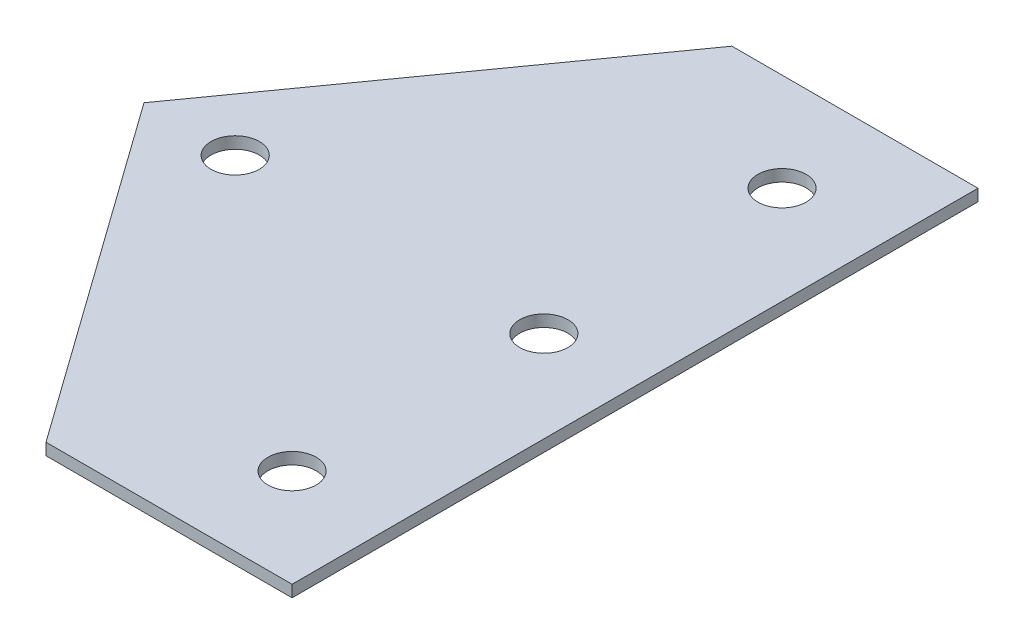
ISO-10303-21;
HEADER;
FILE_DESCRIPTION(('STEP AP214'),'2;1');
FILE_NAME('part.step','',(''),(''),'','','');
FILE_SCHEMA(('AUTOMOTIVE_DESIGN { 1 0 10303 214 1 1 1 1 }'));
ENDSEC;
DATA;
#1=APPLICATION_CONTEXT('core data for automotive mechanical design processes');
#2=APPLICATION_PROTOCOL_DEFINITION('international standard','automotive_design',2000,#1);
#3=PRODUCT_CONTEXT('',#1,'mechanical');
#4=PRODUCT('Part','Part','',(#3));
#5=PRODUCT_RELATED_PRODUCT_CATEGORY('part','',(#4));
#6=PRODUCT_DEFINITION_FORMATION('','',#4);
#7=PRODUCT_DEFINITION_CONTEXT('part definition',#1,'design');
#8=PRODUCT_DEFINITION('design','',#6,#7);
#9=PRODUCT_DEFINITION_SHAPE('','',#8);
#10=(LENGTH_UNIT() NAMED_UNIT(*) SI_UNIT(.MILLI.,.METRE.));
#11=(NAMED_UNIT(*) PLANE_ANGLE_UNIT() SI_UNIT($,.RADIAN.));
#12=(NAMED_UNIT(*) SI_UNIT($,.STERADIAN.) SOLID_ANGLE_UNIT());
#13=UNCERTAINTY_MEASURE_WITH_UNIT(LENGTH_MEASURE(1.E-05),#10,'distance_accuracy_value','');
#14=(GEOMETRIC_REPRESENTATION_CONTEXT(3) GLOBAL_UNCERTAINTY_ASSIGNED_CONTEXT((#13)) GLOBAL_UNIT_ASSIGNED_CONTEXT((#10,
#11,#12)) REPRESENTATION_CONTEXT('',''));
#15=CARTESIAN_POINT('',(0.,0.,0.));
#16=DIRECTION('',(0.,0.,1.));
#17=DIRECTION('',(1.,0.,0.));
#18=AXIS2_PLACEMENT_3D('',#15,#16,#17);
#19=CARTESIAN_POINT('',(-190.779220613583,6.096,0.));
#20=DIRECTION('',(0.813733471206715,0.,0.581238193719124));
#21=DIRECTION('',(0.581238193719124,0.,-0.813733471206715));
#22=AXIS2_PLACEMENT_3D('',#19,#20,#21);
#23=PLANE('',#22);
#24=DIRECTION('',(-0.581238193719124,0.,0.813733471206715));
#25=VECTOR('',#24,1.);
#26=CARTESIAN_POINT('',(-190.779220613583,0.,0.));
#27=LINE('',#26,#25);
#28=CARTESIAN_POINT('',(-63.779220613574,0.,-177.8));
#29=VERTEX_POINT('',#28);
#30=CARTESIAN_POINT('',(-190.779220613583,0.,0.));
#31=VERTEX_POINT('',#30);
#32=EDGE_CURVE('E126',#29,#31,#27,.T.);
#33=ORIENTED_EDGE('',*,*,#32,.T.);
#34=DIRECTION('',(0.,-1.,0.));
#35=VECTOR('',#34,1.);
#36=CARTESIAN_POINT('',(-190.779220613583,6.096,0.));
#37=LINE('',#36,#35);
#38=CARTESIAN_POINT('',(-190.779220613583,6.096,0.));
#39=VERTEX_POINT('',#38);
#40=EDGE_CURVE('E11',#39,#31,#37,.T.);
#41=ORIENTED_EDGE('',*,*,#40,.F.);
#42=DIRECTION('',(-0.581238193719124,0.,0.813733471206715));
#43=VECTOR('',#42,1.);
#44=CARTESIAN_POINT('',(-190.779220613583,6.096,0.));
#45=LINE('',#44,#43);
#46=CARTESIAN_POINT('',(-63.779220613574,6.096,-177.8));
#47=VERTEX_POINT('',#46);
#48=EDGE_CURVE('E139',#47,#39,#45,.T.);
#49=ORIENTED_EDGE('',*,*,#48,.F.);
#50=DIRECTION('',(0.,-1.,0.));
#51=VECTOR('',#50,1.);
#52=CARTESIAN_POINT('',(-63.779220613574,6.096,-177.8));
#53=LINE('',#52,#51);
#54=EDGE_CURVE('E122',#47,#29,#53,.T.);
#55=ORIENTED_EDGE('',*,*,#54,.T.);
#56=EDGE_LOOP('',(#33,#41,#49,#55));
#57=FACE_BOUND('',#56,.T.);
#58=ADVANCED_FACE('F45',(#57),#23,.F.);
#59=CARTESIAN_POINT('',(-63.779220613574,6.096,177.8));
#60=DIRECTION('',(0.813733471206715,0.,-0.581238193719124));
#61=DIRECTION('',(-0.581238193719124,0.,-0.813733471206715));
#62=AXIS2_PLACEMENT_3D('',#59,#60,#61);
#63=PLANE('',#62);
#64=DIRECTION('',(0.581238193719124,0.,0.813733471206715));
#65=VECTOR('',#64,1.);
#66=CARTESIAN_POINT('',(-63.779220613574,0.,177.8));
#67=LINE('',#66,#65);
#68=CARTESIAN_POINT('',(-63.779220613574,0.,177.8));
#69=VERTEX_POINT('',#68);
#70=EDGE_CURVE('E130',#31,#69,#67,.T.);
#71=ORIENTED_EDGE('',*,*,#70,.T.);
#72=DIRECTION('',(0.,-1.,0.));
#73=VECTOR('',#72,1.);
#74=CARTESIAN_POINT('',(-63.779220613574,6.096,177.8));
#75=LINE('',#74,#73);
#76=CARTESIAN_POINT('',(-63.779220613574,6.096,177.8));
#77=VERTEX_POINT('',#76);
#78=EDGE_CURVE('E55',#77,#69,#75,.T.);
#79=ORIENTED_EDGE('',*,*,#78,.F.);
#80=DIRECTION('',(0.581238193719124,0.,0.813733471206715));
#81=VECTOR('',#80,1.);
#82=CARTESIAN_POINT('',(-63.779220613574,6.096,177.8));
#83=LINE('',#82,#81);
#84=EDGE_CURVE('E98',#39,#77,#83,.T.);
#85=ORIENTED_EDGE('',*,*,#84,.F.);
#86=ORIENTED_EDGE('',*,*,#40,.T.);
#87=EDGE_LOOP('',(#71,#79,#85,#86));
#88=FACE_BOUND('',#87,.T.);
#89=ADVANCED_FACE('F173',(#88),#63,.F.);
#90=CARTESIAN_POINT('',(63.779220613574,6.096,177.8));
#91=DIRECTION('',(0.,0.,-1.));
#92=DIRECTION('',(-1.,0.,0.));
#93=AXIS2_PLACEMENT_3D('',#90,#91,#92);
#94=PLANE('',#93);
#95=DIRECTION('',(1.,0.,0.));
#96=VECTOR('',#95,1.);
#97=CARTESIAN_POINT('',(63.779220613574,0.,177.8));
#98=LINE('',#97,#96);
#99=CARTESIAN_POINT('',(63.779220613574,0.,177.8));
#100=VERTEX_POINT('',#99);
#101=EDGE_CURVE('E114',#69,#100,#98,.T.);
#102=ORIENTED_EDGE('',*,*,#101,.T.);
#103=DIRECTION('',(0.,-1.,0.));
#104=VECTOR('',#103,1.);
#105=CARTESIAN_POINT('',(63.779220613574,6.096,177.8));
#106=LINE('',#105,#104);
#107=CARTESIAN_POINT('',(63.779220613574,6.096,177.8));
#108=VERTEX_POINT('',#107);
#109=EDGE_CURVE('E111',#108,#100,#106,.T.);
#110=ORIENTED_EDGE('',*,*,#109,.F.);
#111=DIRECTION('',(1.,0.,0.));
#112=VECTOR('',#111,1.);
#113=CARTESIAN_POINT('',(63.779220613574,6.096,177.8));
#114=LINE('',#113,#112);
#115=EDGE_CURVE('E102',#77,#108,#114,.T.);
#116=ORIENTED_EDGE('',*,*,#115,.F.);
#117=ORIENTED_EDGE('',*,*,#78,.T.);
#118=EDGE_LOOP('',(#102,#110,#116,#117));
#119=FACE_BOUND('',#118,.T.);
#120=ADVANCED_FACE('F112',(#119),#94,.F.);
#121=CARTESIAN_POINT('',(63.779220613574,6.096,177.8));
#122=DIRECTION('',(-1.,0.,0.));
#123=DIRECTION('',(0.,0.,1.));
#124=AXIS2_PLACEMENT_3D('',#121,#122,#123);
#125=PLANE('',#124);
#126=DIRECTION('',(0.,0.,-1.));
#127=VECTOR('',#126,1.);
#128=CARTESIAN_POINT('',(63.779220613574,0.,177.8));
#129=LINE('',#128,#127);
#130=CARTESIAN_POINT('',(63.779220613574,0.,-177.8));
#131=VERTEX_POINT('',#130);
#132=EDGE_CURVE('E84',#100,#131,#129,.T.);
#133=ORIENTED_EDGE('',*,*,#132,.T.);
#134=DIRECTION('',(0.,-1.,0.));
#135=VECTOR('',#134,1.);
#136=CARTESIAN_POINT('',(63.779220613574,6.096,-177.8));
#137=LINE('',#136,#135);
#138=CARTESIAN_POINT('',(63.779220613574,6.096,-177.8));
#139=VERTEX_POINT('',#138);
#140=EDGE_CURVE('E116',#139,#131,#137,.T.);
#141=ORIENTED_EDGE('',*,*,#140,.F.);
#142=DIRECTION('',(0.,0.,-1.));
#143=VECTOR('',#142,1.);
#144=CARTESIAN_POINT('',(63.779220613574,6.096,177.8));
#145=LINE('',#144,#143);
#146=EDGE_CURVE('E106',#108,#139,#145,.T.);
#147=ORIENTED_EDGE('',*,*,#146,.F.);
#148=ORIENTED_EDGE('',*,*,#109,.T.);
#149=EDGE_LOOP('',(#133,#141,#147,#148));
#150=FACE_BOUND('',#149,.T.);
#151=ADVANCED_FACE('F118',(#150),#125,.F.);
#152=CARTESIAN_POINT('',(63.779220613574,6.096,-177.8));
#153=DIRECTION('',(0.,0.,1.));
#154=DIRECTION('',(1.,0.,0.));
#155=AXIS2_PLACEMENT_3D('',#152,#153,#154);
#156=PLANE('',#155);
#157=DIRECTION('',(-1.,0.,0.));
#158=VECTOR('',#157,1.);
#159=CARTESIAN_POINT('',(63.779220613574,0.,-177.8));
#160=LINE('',#159,#158);
#161=EDGE_CURVE('E90',#131,#29,#160,.T.);
#162=ORIENTED_EDGE('',*,*,#161,.T.);
#163=ORIENTED_EDGE('',*,*,#54,.F.);
#164=DIRECTION('',(-1.,0.,0.));
#165=VECTOR('',#164,1.);
#166=CARTESIAN_POINT('',(63.779220613574,6.096,-177.8));
#167=LINE('',#166,#165);
#168=EDGE_CURVE('E64',#139,#47,#167,.T.);
#169=ORIENTED_EDGE('',*,*,#168,.F.);
#170=ORIENTED_EDGE('',*,*,#140,.T.);
#171=EDGE_LOOP('',(#162,#163,#169,#170));
#172=FACE_BOUND('',#171,.T.);
#173=ADVANCED_FACE('F188',(#172),#156,.F.);
#174=CARTESIAN_POINT('',(0.,6.096,0.));
#175=DIRECTION('',(0.,1.,0.));
#176=DIRECTION('',(0.,0.,1.));
#177=AXIS2_PLACEMENT_3D('',#174,#175,#176);
#178=PLANE('',#177);
#179=CARTESIAN_POINT('',(12.979220613574,6.096,127.));
#180=DIRECTION('',(0.,1.,0.));
#181=DIRECTION('',(0.,0.,1.));
#182=AXIS2_PLACEMENT_3D('',#179,#180,#181);
#183=CIRCLE('',#182,12.5);
#184=CARTESIAN_POINT('',(12.979220613574,6.096,139.5));
#185=VERTEX_POINT('',#184);
#186=EDGE_CURVE('E161',#185,#185,#183,.F.);
#187=ORIENTED_EDGE('',*,*,#186,.T.);
#188=EDGE_LOOP('',(#187));
#189=FACE_BOUND('',#188,.T.);
#190=CARTESIAN_POINT('',(12.979220613574,6.096,-127.));
#191=DIRECTION('',(0.,1.,0.));
#192=DIRECTION('',(0.,0.,1.));
#193=AXIS2_PLACEMENT_3D('',#190,#191,#192);
#194=CIRCLE('',#193,12.5);
#195=CARTESIAN_POINT('',(12.979220613574,6.096,-114.5));
#196=VERTEX_POINT('',#195);
#197=EDGE_CURVE('E264',#196,#196,#194,.F.);
#198=ORIENTED_EDGE('',*,*,#197,.T.);
#199=EDGE_LOOP('',(#198));
#200=FACE_BOUND('',#199,.T.);
#201=CARTESIAN_POINT('',(-143.499999999999,6.096,-3.98292510084275E-12));
#202=DIRECTION('',(0.,1.,0.));
#203=DIRECTION('',(0.,0.,1.));
#204=AXIS2_PLACEMENT_3D('',#201,#202,#203);
#205=CIRCLE('',#204,12.4999999999931);
#206=CARTESIAN_POINT('',(-143.499999999999,6.096,12.4999999999891));
#207=VERTEX_POINT('',#206);
#208=EDGE_CURVE('E148',#207,#207,#205,.T.);
#209=ORIENTED_EDGE('',*,*,#208,.F.);
#210=EDGE_LOOP('',(#209));
#211=FACE_BOUND('',#210,.T.);
#212=CARTESIAN_POINT('',(16.5000000000013,6.096,-1.98452365651747E-12));
#213=DIRECTION('',(0.,1.,0.));
#214=DIRECTION('',(0.,0.,1.));
#215=AXIS2_PLACEMENT_3D('',#212,#213,#214);
#216=CIRCLE('',#215,12.4999999999937);
#217=CARTESIAN_POINT('',(16.5000000000013,6.096,12.4999999999917));
#218=VERTEX_POINT('',#217);
#219=EDGE_CURVE('E155',#218,#218,#216,.T.);
#220=ORIENTED_EDGE('',*,*,#219,.F.);
#221=EDGE_LOOP('',(#220));
#222=FACE_BOUND('',#221,.T.);
#223=ORIENTED_EDGE('',*,*,#48,.T.);
#224=ORIENTED_EDGE('',*,*,#84,.T.);
#225=ORIENTED_EDGE('',*,*,#115,.T.);
#226=ORIENTED_EDGE('',*,*,#146,.T.);
#227=ORIENTED_EDGE('',*,*,#168,.T.);
#228=EDGE_LOOP('',(#223,#224,#225,#226,#227));
#229=FACE_BOUND('',#228,.T.);
#230=ADVANCED_FACE('F104',(#189,#200,#211,#222,#229),#178,.T.);
#231=CARTESIAN_POINT('',(0.,0.,0.));
#232=DIRECTION('',(0.,1.,0.));
#233=DIRECTION('',(0.,0.,1.));
#234=AXIS2_PLACEMENT_3D('',#231,#232,#233);
#235=PLANE('',#234);
#236=CARTESIAN_POINT('',(12.979220613574,0.,127.));
#237=DIRECTION('',(0.,-1.,0.));
#238=DIRECTION('',(0.,0.,-1.));
#239=AXIS2_PLACEMENT_3D('',#236,#237,#238);
#240=CIRCLE('',#239,12.5);
#241=CARTESIAN_POINT('',(12.979220613574,0.,114.5));
#242=VERTEX_POINT('',#241);
#243=EDGE_CURVE('E257',#242,#242,#240,.T.);
#244=ORIENTED_EDGE('',*,*,#243,.F.);
#245=EDGE_LOOP('',(#244));
#246=FACE_BOUND('',#245,.T.);
#247=CARTESIAN_POINT('',(12.979220613574,0.,-127.));
#248=DIRECTION('',(0.,-1.,0.));
#249=DIRECTION('',(0.,0.,1.));
#250=AXIS2_PLACEMENT_3D('',#247,#248,#249);
#251=CIRCLE('',#250,12.5);
#252=CARTESIAN_POINT('',(12.979220613574,0.,-114.5));
#253=VERTEX_POINT('',#252);
#254=EDGE_CURVE('E164',#253,#253,#251,.T.);
#255=ORIENTED_EDGE('',*,*,#254,.F.);
#256=EDGE_LOOP('',(#255));
#257=FACE_BOUND('',#256,.T.);
#258=CARTESIAN_POINT('',(-143.499999999999,0.,-3.98292510084275E-12));
#259=DIRECTION('',(0.,1.,0.));
#260=DIRECTION('',(0.,0.,1.));
#261=AXIS2_PLACEMENT_3D('',#258,#259,#260);
#262=CIRCLE('',#261,12.4999999999931);
#263=CARTESIAN_POINT('',(-143.499999999999,0.,12.4999999999891));
#264=VERTEX_POINT('',#263);
#265=EDGE_CURVE('E48',#264,#264,#262,.T.);
#266=ORIENTED_EDGE('',*,*,#265,.T.);
#267=EDGE_LOOP('',(#266));
#268=FACE_BOUND('',#267,.T.);
#269=CARTESIAN_POINT('',(16.5000000000013,0.,-1.98452365651747E-12));
#270=DIRECTION('',(0.,1.,0.));
#271=DIRECTION('',(0.,0.,1.));
#272=AXIS2_PLACEMENT_3D('',#269,#270,#271);
#273=CIRCLE('',#272,12.4999999999937);
#274=CARTESIAN_POINT('',(16.5000000000013,0.,12.4999999999917));
#275=VERTEX_POINT('',#274);
#276=EDGE_CURVE('E145',#275,#275,#273,.T.);
#277=ORIENTED_EDGE('',*,*,#276,.T.);
#278=EDGE_LOOP('',(#277));
#279=FACE_BOUND('',#278,.T.);
#280=ORIENTED_EDGE('',*,*,#32,.F.);
#281=ORIENTED_EDGE('',*,*,#161,.F.);
#282=ORIENTED_EDGE('',*,*,#132,.F.);
#283=ORIENTED_EDGE('',*,*,#101,.F.);
#284=ORIENTED_EDGE('',*,*,#70,.F.);
#285=EDGE_LOOP('',(#280,#281,#282,#283,#284));
#286=FACE_BOUND('',#285,.T.);
#287=ADVANCED_FACE('F175',(#246,#257,#268,#279,#286),#235,.F.);
#288=CARTESIAN_POINT('',(16.5000000000013,-38.354,-1.98452365651747E-12));
#289=DIRECTION('',(0.,1.,0.));
#290=DIRECTION('',(0.,0.,1.));
#291=AXIS2_PLACEMENT_3D('',#288,#289,#290);
#292=CYLINDRICAL_SURFACE('',#291,12.4999999999937);
#293=ORIENTED_EDGE('',*,*,#219,.T.);
#294=EDGE_LOOP('',(#293));
#295=FACE_BOUND('',#294,.T.);
#296=ORIENTED_EDGE('',*,*,#276,.F.);
#297=EDGE_LOOP('',(#296));
#298=FACE_BOUND('',#297,.T.);
#299=ADVANCED_FACE('F177',(#295,#298),#292,.F.);
#300=CARTESIAN_POINT('',(-143.499999999999,-38.354,-3.98292510084275E-12));
#301=DIRECTION('',(0.,1.,0.));
#302=DIRECTION('',(0.,0.,1.));
#303=AXIS2_PLACEMENT_3D('',#300,#301,#302);
#304=CYLINDRICAL_SURFACE('',#303,12.4999999999931);
#305=ORIENTED_EDGE('',*,*,#208,.T.);
#306=EDGE_LOOP('',(#305));
#307=FACE_BOUND('',#306,.T.);
#308=ORIENTED_EDGE('',*,*,#265,.F.);
#309=EDGE_LOOP('',(#308));
#310=FACE_BOUND('',#309,.T.);
#311=ADVANCED_FACE('F185',(#307,#310),#304,.F.);
#312=CARTESIAN_POINT('',(12.979220613574,41.4513390593275,-127.));
#313=DIRECTION('',(0.,-1.,0.));
#314=DIRECTION('',(0.,0.,-1.));
#315=AXIS2_PLACEMENT_3D('',#312,#313,#314);
#316=CYLINDRICAL_SURFACE('',#315,12.5);
#317=ORIENTED_EDGE('',*,*,#254,.T.);
#318=EDGE_LOOP('',(#317));
#319=FACE_BOUND('',#318,.T.);
#320=ORIENTED_EDGE('',*,*,#197,.F.);
#321=EDGE_LOOP('',(#320));
#322=FACE_BOUND('',#321,.T.);
#323=ADVANCED_FACE('F221',(#319,#322),#316,.F.);
#324=CARTESIAN_POINT('',(12.979220613574,41.4513390593275,127.));
#325=DIRECTION('',(0.,-1.,0.));
#326=DIRECTION('',(0.,0.,-1.));
#327=AXIS2_PLACEMENT_3D('',#324,#325,#326);
#328=CYLINDRICAL_SURFACE('',#327,12.5);
#329=ORIENTED_EDGE('',*,*,#243,.T.);
#330=EDGE_LOOP('',(#329));
#331=FACE_BOUND('',#330,.T.);
#332=ORIENTED_EDGE('',*,*,#186,.F.);
#333=EDGE_LOOP('',(#332));
#334=FACE_BOUND('',#333,.T.);
#335=ADVANCED_FACE('F241',(#331,#334),#328,.F.);
#336=CLOSED_SHELL('',(#58,#89,#120,#151,#173,#230,#287,#299,#311,#323,#335));
#337=MANIFOLD_SOLID_BREP('B2',#336);
#338=ADVANCED_BREP_SHAPE_REPRESENTATION('',(#18,#337),#14);
#339=SHAPE_DEFINITION_REPRESENTATION(#9,#338);
ENDSEC;
END-ISO-10303-21;
